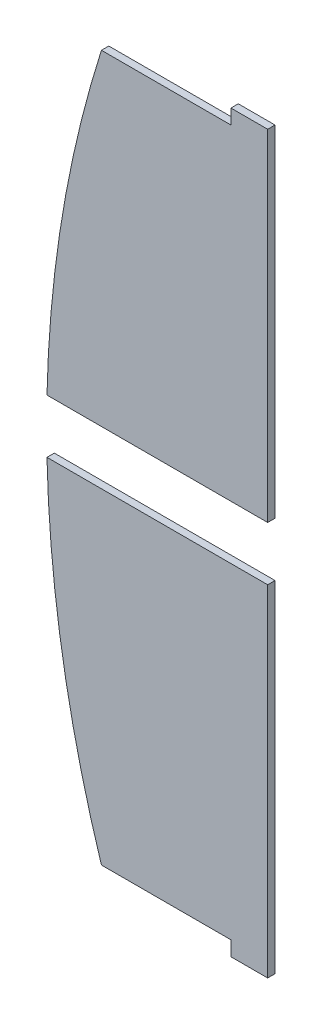
ISO-10303-21;
HEADER;
FILE_DESCRIPTION(('STEP AP214'),'2;1');
FILE_NAME('part.step','',(''),(''),'','','');
FILE_SCHEMA(('AUTOMOTIVE_DESIGN { 1 0 10303 214 1 1 1 1 }'));
ENDSEC;
DATA;
#1=APPLICATION_CONTEXT('core data for automotive mechanical design processes');
#2=APPLICATION_PROTOCOL_DEFINITION('international standard','automotive_design',2000,#1);
#3=PRODUCT_CONTEXT('',#1,'mechanical');
#4=PRODUCT('Part','Part','',(#3));
#5=PRODUCT_RELATED_PRODUCT_CATEGORY('part','',(#4));
#6=PRODUCT_DEFINITION_FORMATION('','',#4);
#7=PRODUCT_DEFINITION_CONTEXT('part definition',#1,'design');
#8=PRODUCT_DEFINITION('design','',#6,#7);
#9=PRODUCT_DEFINITION_SHAPE('','',#8);
#10=(LENGTH_UNIT() NAMED_UNIT(*) SI_UNIT(.MILLI.,.METRE.));
#11=(NAMED_UNIT(*) PLANE_ANGLE_UNIT() SI_UNIT($,.RADIAN.));
#12=(NAMED_UNIT(*) SI_UNIT($,.STERADIAN.) SOLID_ANGLE_UNIT());
#13=UNCERTAINTY_MEASURE_WITH_UNIT(LENGTH_MEASURE(1.E-05),#10,'distance_accuracy_value','');
#14=(GEOMETRIC_REPRESENTATION_CONTEXT(3) GLOBAL_UNCERTAINTY_ASSIGNED_CONTEXT((#13)) GLOBAL_UNIT_ASSIGNED_CONTEXT((#10,
#11,#12)) REPRESENTATION_CONTEXT('',''));
#15=CARTESIAN_POINT('',(0.,0.,0.));
#16=DIRECTION('',(0.,0.,1.));
#17=DIRECTION('',(1.,0.,0.));
#18=AXIS2_PLACEMENT_3D('',#15,#16,#17);
#19=CARTESIAN_POINT('',(0.,0.,-6.));
#20=DIRECTION('',(0.,0.,1.));
#21=DIRECTION('',(1.,0.,0.));
#22=AXIS2_PLACEMENT_3D('',#19,#20,#21);
#23=CYLINDRICAL_SURFACE('',#22,950.);
#24=DIRECTION('',(0.,0.,1.));
#25=VECTOR('',#24,1.);
#26=CARTESIAN_POINT('',(-905.293322630848,288.,-6.));
#27=LINE('',#26,#25);
#28=CARTESIAN_POINT('',(-905.293322630848,288.,-6.));
#29=VERTEX_POINT('',#28);
#30=CARTESIAN_POINT('',(-905.293322630848,288.,0.));
#31=VERTEX_POINT('',#30);
#32=EDGE_CURVE('E114',#29,#31,#27,.T.);
#33=ORIENTED_EDGE('',*,*,#32,.F.);
#34=CARTESIAN_POINT('',(0.,0.,-6.));
#35=DIRECTION('',(0.,0.,1.));
#36=DIRECTION('',(1.,0.,0.));
#37=AXIS2_PLACEMENT_3D('',#34,#35,#36);
#38=CIRCLE('',#37,950.);
#39=CARTESIAN_POINT('',(-949.74522899565,21.9999999999999,-6.));
#40=VERTEX_POINT('',#39);
#41=EDGE_CURVE('E126',#29,#40,#38,.T.);
#42=ORIENTED_EDGE('',*,*,#41,.T.);
#43=DIRECTION('',(0.,0.,1.));
#44=VECTOR('',#43,1.);
#45=CARTESIAN_POINT('',(-949.74522899565,21.9999999999999,-6.));
#46=LINE('',#45,#44);
#47=CARTESIAN_POINT('',(-949.74522899565,21.9999999999999,0.));
#48=VERTEX_POINT('',#47);
#49=EDGE_CURVE('E129',#48,#40,#46,.F.);
#50=ORIENTED_EDGE('',*,*,#49,.F.);
#51=CARTESIAN_POINT('',(0.,0.,0.));
#52=DIRECTION('',(0.,0.,1.));
#53=DIRECTION('',(1.,0.,0.));
#54=AXIS2_PLACEMENT_3D('',#51,#52,#53);
#55=CIRCLE('',#54,950.);
#56=EDGE_CURVE('E74',#31,#48,#55,.T.);
#57=ORIENTED_EDGE('',*,*,#56,.F.);
#58=EDGE_LOOP('',(#33,#42,#50,#57));
#59=FACE_BOUND('',#58,.T.);
#60=ADVANCED_FACE('F52',(#59),#23,.T.);
#61=CARTESIAN_POINT('',(0.,0.,-6.));
#62=DIRECTION('',(0.,0.,1.));
#63=DIRECTION('',(1.,0.,0.));
#64=AXIS2_PLACEMENT_3D('',#61,#62,#63);
#65=PLANE('',#64);
#66=DIRECTION('',(1.,0.,0.));
#67=VECTOR('',#66,1.);
#68=CARTESIAN_POINT('',(0.,288.,-6.));
#69=LINE('',#68,#67);
#70=CARTESIAN_POINT('',(-799.601809837321,288.,-6.));
#71=VERTEX_POINT('',#70);
#72=EDGE_CURVE('E123',#29,#71,#69,.T.);
#73=ORIENTED_EDGE('',*,*,#72,.T.);
#74=DIRECTION('',(0.,1.,0.));
#75=VECTOR('',#74,1.);
#76=CARTESIAN_POINT('',(-799.601809837321,0.,-6.));
#77=LINE('',#76,#75);
#78=CARTESIAN_POINT('',(-799.601809837321,300.,-6.00000000000001));
#79=VERTEX_POINT('',#78);
#80=EDGE_CURVE('E107',#71,#79,#77,.T.);
#81=ORIENTED_EDGE('',*,*,#80,.T.);
#82=DIRECTION('',(1.,0.,0.));
#83=VECTOR('',#82,1.);
#84=CARTESIAN_POINT('',(1.11022302462516E-13,300.,-6.));
#85=LINE('',#84,#83);
#86=CARTESIAN_POINT('',(-769.601809837321,300.,-6.00000000000001));
#87=VERTEX_POINT('',#86);
#88=EDGE_CURVE('E132',#87,#79,#85,.F.);
#89=ORIENTED_EDGE('',*,*,#88,.F.);
#90=DIRECTION('',(0.,-1.,0.));
#91=VECTOR('',#90,1.);
#92=CARTESIAN_POINT('',(-769.601809837321,300.,-6.00000000000001));
#93=LINE('',#92,#91);
#94=CARTESIAN_POINT('',(-769.601809837321,22.,-6.00000000000001));
#95=VERTEX_POINT('',#94);
#96=EDGE_CURVE('E143',#87,#95,#93,.T.);
#97=ORIENTED_EDGE('',*,*,#96,.T.);
#98=DIRECTION('',(-1.,0.,0.));
#99=VECTOR('',#98,1.);
#100=CARTESIAN_POINT('',(0.,22.0000000000001,-6.));
#101=LINE('',#100,#99);
#102=EDGE_CURVE('E140',#95,#40,#101,.T.);
#103=ORIENTED_EDGE('',*,*,#102,.T.);
#104=ORIENTED_EDGE('',*,*,#41,.F.);
#105=EDGE_LOOP('',(#73,#81,#89,#97,#103,#104));
#106=FACE_BOUND('',#105,.T.);
#107=ADVANCED_FACE('F157',(#106),#65,.F.);
#108=CARTESIAN_POINT('',(0.,0.,0.));
#109=DIRECTION('',(0.,0.,1.));
#110=DIRECTION('',(1.,0.,0.));
#111=AXIS2_PLACEMENT_3D('',#108,#109,#110);
#112=PLANE('',#111);
#113=DIRECTION('',(0.,1.,0.));
#114=VECTOR('',#113,1.);
#115=CARTESIAN_POINT('',(-799.601809837321,300.,0.));
#116=LINE('',#115,#114);
#117=CARTESIAN_POINT('',(-799.601809837321,288.,0.));
#118=VERTEX_POINT('',#117);
#119=CARTESIAN_POINT('',(-799.601809837321,300.,0.));
#120=VERTEX_POINT('',#119);
#121=EDGE_CURVE('E65',#118,#120,#116,.T.);
#122=ORIENTED_EDGE('',*,*,#121,.F.);
#123=DIRECTION('',(1.,0.,0.));
#124=VECTOR('',#123,1.);
#125=CARTESIAN_POINT('',(-799.601809837321,288.,0.));
#126=LINE('',#125,#124);
#127=EDGE_CURVE('E110',#31,#118,#126,.T.);
#128=ORIENTED_EDGE('',*,*,#127,.F.);
#129=ORIENTED_EDGE('',*,*,#56,.T.);
#130=DIRECTION('',(-1.,0.,0.));
#131=VECTOR('',#130,1.);
#132=CARTESIAN_POINT('',(-560.458867551649,22.,0.));
#133=LINE('',#132,#131);
#134=CARTESIAN_POINT('',(-769.601809837321,22.,0.));
#135=VERTEX_POINT('',#134);
#136=EDGE_CURVE('E59',#135,#48,#133,.T.);
#137=ORIENTED_EDGE('',*,*,#136,.F.);
#138=DIRECTION('',(0.,1.,0.));
#139=VECTOR('',#138,1.);
#140=CARTESIAN_POINT('',(-769.601809837321,300.,0.));
#141=LINE('',#140,#139);
#142=CARTESIAN_POINT('',(-769.601809837321,300.,0.));
#143=VERTEX_POINT('',#142);
#144=EDGE_CURVE('E131',#135,#143,#141,.T.);
#145=ORIENTED_EDGE('',*,*,#144,.T.);
#146=DIRECTION('',(-1.,0.,0.));
#147=VECTOR('',#146,1.);
#148=CARTESIAN_POINT('',(-1527.14795921947,300.,0.));
#149=LINE('',#148,#147);
#150=EDGE_CURVE('E119',#143,#120,#149,.T.);
#151=ORIENTED_EDGE('',*,*,#150,.T.);
#152=EDGE_LOOP('',(#122,#128,#129,#137,#145,#151));
#153=FACE_BOUND('',#152,.T.);
#154=ADVANCED_FACE('F117',(#153),#112,.T.);
#155=CARTESIAN_POINT('',(-769.601809837321,300.,-610.115804443304));
#156=DIRECTION('',(1.,0.,0.));
#157=DIRECTION('',(0.,1.,0.));
#158=AXIS2_PLACEMENT_3D('',#155,#156,#157);
#159=PLANE('',#158);
#160=DIRECTION('',(0.,0.,1.));
#161=VECTOR('',#160,1.);
#162=CARTESIAN_POINT('',(-769.601809837321,22.,-610.115804443304));
#163=LINE('',#162,#161);
#164=EDGE_CURVE('E127',#95,#135,#163,.T.);
#165=ORIENTED_EDGE('',*,*,#164,.F.);
#166=ORIENTED_EDGE('',*,*,#96,.F.);
#167=DIRECTION('',(0.,0.,1.));
#168=VECTOR('',#167,1.);
#169=CARTESIAN_POINT('',(-769.601809837321,300.,-610.115804443304));
#170=LINE('',#169,#168);
#171=EDGE_CURVE('E135',#87,#143,#170,.T.);
#172=ORIENTED_EDGE('',*,*,#171,.T.);
#173=ORIENTED_EDGE('',*,*,#144,.F.);
#174=EDGE_LOOP('',(#165,#166,#172,#173));
#175=FACE_BOUND('',#174,.T.);
#176=ADVANCED_FACE('F155',(#175),#159,.T.);
#177=CARTESIAN_POINT('',(-1527.14795921947,300.,0.));
#178=DIRECTION('',(0.,1.,0.));
#179=DIRECTION('',(-1.,0.,0.));
#180=AXIS2_PLACEMENT_3D('',#177,#178,#179);
#181=PLANE('',#180);
#182=DIRECTION('',(0.,0.,-1.));
#183=VECTOR('',#182,1.);
#184=CARTESIAN_POINT('',(-799.601809837321,300.,0.));
#185=LINE('',#184,#183);
#186=EDGE_CURVE('E12',#120,#79,#185,.T.);
#187=ORIENTED_EDGE('',*,*,#186,.F.);
#188=ORIENTED_EDGE('',*,*,#150,.F.);
#189=ORIENTED_EDGE('',*,*,#171,.F.);
#190=ORIENTED_EDGE('',*,*,#88,.T.);
#191=EDGE_LOOP('',(#187,#188,#189,#190));
#192=FACE_BOUND('',#191,.T.);
#193=ADVANCED_FACE('F153',(#192),#181,.T.);
#194=CARTESIAN_POINT('',(-560.458867551649,22.,-10.));
#195=DIRECTION('',(0.,1.,0.));
#196=DIRECTION('',(-1.,0.,0.));
#197=AXIS2_PLACEMENT_3D('',#194,#195,#196);
#198=PLANE('',#197);
#199=ORIENTED_EDGE('',*,*,#49,.T.);
#200=ORIENTED_EDGE('',*,*,#102,.F.);
#201=ORIENTED_EDGE('',*,*,#164,.T.);
#202=ORIENTED_EDGE('',*,*,#136,.T.);
#203=EDGE_LOOP('',(#199,#200,#201,#202));
#204=FACE_BOUND('',#203,.T.);
#205=ADVANCED_FACE('F162',(#204),#198,.F.);
#206=CARTESIAN_POINT('',(-799.601809837321,300.,-10.));
#207=DIRECTION('',(1.,0.,0.));
#208=DIRECTION('',(0.,0.,-1.));
#209=AXIS2_PLACEMENT_3D('',#206,#207,#208);
#210=PLANE('',#209);
#211=DIRECTION('',(0.,0.,1.));
#212=VECTOR('',#211,1.);
#213=CARTESIAN_POINT('',(-799.601809837321,288.,-10.));
#214=LINE('',#213,#212);
#215=EDGE_CURVE('E103',#71,#118,#214,.T.);
#216=ORIENTED_EDGE('',*,*,#215,.T.);
#217=ORIENTED_EDGE('',*,*,#121,.T.);
#218=ORIENTED_EDGE('',*,*,#186,.T.);
#219=ORIENTED_EDGE('',*,*,#80,.F.);
#220=EDGE_LOOP('',(#216,#217,#218,#219));
#221=FACE_BOUND('',#220,.T.);
#222=ADVANCED_FACE('F105',(#221),#210,.F.);
#223=CARTESIAN_POINT('',(-799.601809837321,288.,-10.));
#224=DIRECTION('',(0.,-1.,0.));
#225=DIRECTION('',(1.,0.,0.));
#226=AXIS2_PLACEMENT_3D('',#223,#224,#225);
#227=PLANE('',#226);
#228=ORIENTED_EDGE('',*,*,#32,.T.);
#229=ORIENTED_EDGE('',*,*,#127,.T.);
#230=ORIENTED_EDGE('',*,*,#215,.F.);
#231=ORIENTED_EDGE('',*,*,#72,.F.);
#232=EDGE_LOOP('',(#228,#229,#230,#231));
#233=FACE_BOUND('',#232,.T.);
#234=ADVANCED_FACE('F112',(#233),#227,.F.);
#235=CLOSED_SHELL('',(#60,#107,#154,#176,#193,#205,#222,#234));
#236=MANIFOLD_SOLID_BREP('B2',#235);
#237=CARTESIAN_POINT('',(-1527.14795921947,-300.,0.));
#238=DIRECTION('',(0.,-1.,0.));
#239=DIRECTION('',(1.,0.,0.));
#240=AXIS2_PLACEMENT_3D('',#237,#238,#239);
#241=PLANE('',#240);
#242=DIRECTION('',(0.,0.,1.));
#243=VECTOR('',#242,1.);
#244=CARTESIAN_POINT('',(-799.601809837321,-300.,-10.));
#245=LINE('',#244,#243);
#246=CARTESIAN_POINT('',(-799.601809837321,-300.,-6.));
#247=VERTEX_POINT('',#246);
#248=CARTESIAN_POINT('',(-799.601809837321,-300.,0.));
#249=VERTEX_POINT('',#248);
#250=EDGE_CURVE('E287',#247,#249,#245,.T.);
#251=ORIENTED_EDGE('',*,*,#250,.F.);
#252=DIRECTION('',(1.,0.,0.));
#253=VECTOR('',#252,1.);
#254=CARTESIAN_POINT('',(1.11022302462516E-13,-300.,-6.));
#255=LINE('',#254,#253);
#256=CARTESIAN_POINT('',(-769.601809837321,-300.,-6.00000000000001));
#257=VERTEX_POINT('',#256);
#258=EDGE_CURVE('E320',#247,#257,#255,.T.);
#259=ORIENTED_EDGE('',*,*,#258,.T.);
#260=DIRECTION('',(0.,0.,1.));
#261=VECTOR('',#260,1.);
#262=CARTESIAN_POINT('',(-769.601809837321,-300.,-610.115804443304));
#263=LINE('',#262,#261);
#264=CARTESIAN_POINT('',(-769.601809837321,-300.,0.));
#265=VERTEX_POINT('',#264);
#266=EDGE_CURVE('E315',#257,#265,#263,.T.);
#267=ORIENTED_EDGE('',*,*,#266,.T.);
#268=DIRECTION('',(1.,0.,0.));
#269=VECTOR('',#268,1.);
#270=CARTESIAN_POINT('',(-1527.14795921947,-300.,0.));
#271=LINE('',#270,#269);
#272=EDGE_CURVE('E314',#249,#265,#271,.T.);
#273=ORIENTED_EDGE('',*,*,#272,.F.);
#274=EDGE_LOOP('',(#251,#259,#267,#273));
#275=FACE_BOUND('',#274,.T.);
#276=ADVANCED_FACE('F230',(#275),#241,.T.);
#277=CARTESIAN_POINT('',(-769.601809837321,300.,-610.115804443304));
#278=DIRECTION('',(1.,0.,0.));
#279=DIRECTION('',(0.,1.,0.));
#280=AXIS2_PLACEMENT_3D('',#277,#278,#279);
#281=PLANE('',#280);
#282=DIRECTION('',(0.,0.,-1.));
#283=VECTOR('',#282,1.);
#284=CARTESIAN_POINT('',(-769.601809837321,-21.9999999999999,-610.115804443304));
#285=LINE('',#284,#283);
#286=CARTESIAN_POINT('',(-769.601809837321,-22.,0.));
#287=VERTEX_POINT('',#286);
#288=CARTESIAN_POINT('',(-769.601809837321,-21.9999999999999,-6.00000000000001));
#289=VERTEX_POINT('',#288);
#290=EDGE_CURVE('E326',#287,#289,#285,.T.);
#291=ORIENTED_EDGE('',*,*,#290,.F.);
#292=DIRECTION('',(0.,1.,0.));
#293=VECTOR('',#292,1.);
#294=CARTESIAN_POINT('',(-769.601809837321,300.,0.));
#295=LINE('',#294,#293);
#296=EDGE_CURVE('E310',#265,#287,#295,.T.);
#297=ORIENTED_EDGE('',*,*,#296,.F.);
#298=ORIENTED_EDGE('',*,*,#266,.F.);
#299=DIRECTION('',(0.,-1.,0.));
#300=VECTOR('',#299,1.);
#301=CARTESIAN_POINT('',(-769.601809837321,300.,-6.00000000000001));
#302=LINE('',#301,#300);
#303=EDGE_CURVE('E311',#289,#257,#302,.T.);
#304=ORIENTED_EDGE('',*,*,#303,.F.);
#305=EDGE_LOOP('',(#291,#297,#298,#304));
#306=FACE_BOUND('',#305,.T.);
#307=ADVANCED_FACE('F338',(#306),#281,.T.);
#308=CARTESIAN_POINT('',(1.11022302462516E-13,0.,0.));
#309=DIRECTION('',(0.,0.,1.));
#310=DIRECTION('',(1.,0.,0.));
#311=AXIS2_PLACEMENT_3D('',#308,#309,#310);
#312=PLANE('',#311);
#313=DIRECTION('',(0.,1.,0.));
#314=VECTOR('',#313,1.);
#315=CARTESIAN_POINT('',(-799.601809837321,-300.,0.));
#316=LINE('',#315,#314);
#317=CARTESIAN_POINT('',(-799.601809837321,-288.,0.));
#318=VERTEX_POINT('',#317);
#319=EDGE_CURVE('E290',#249,#318,#316,.T.);
#320=ORIENTED_EDGE('',*,*,#319,.F.);
#321=ORIENTED_EDGE('',*,*,#272,.T.);
#322=ORIENTED_EDGE('',*,*,#296,.T.);
#323=DIRECTION('',(1.,0.,0.));
#324=VECTOR('',#323,1.);
#325=CARTESIAN_POINT('',(-560.458867551649,-21.9999999999999,0.));
#326=LINE('',#325,#324);
#327=CARTESIAN_POINT('',(-949.74522899565,-22.,0.));
#328=VERTEX_POINT('',#327);
#329=EDGE_CURVE('E253',#328,#287,#326,.T.);
#330=ORIENTED_EDGE('',*,*,#329,.F.);
#331=CARTESIAN_POINT('',(1.11022302462516E-13,0.,0.));
#332=DIRECTION('',(0.,0.,1.));
#333=DIRECTION('',(1.,0.,0.));
#334=AXIS2_PLACEMENT_3D('',#331,#332,#333);
#335=CIRCLE('',#334,950.);
#336=CARTESIAN_POINT('',(-905.293322630848,-288.,0.));
#337=VERTEX_POINT('',#336);
#338=EDGE_CURVE('E299',#328,#337,#335,.T.);
#339=ORIENTED_EDGE('',*,*,#338,.T.);
#340=DIRECTION('',(-1.,0.,0.));
#341=VECTOR('',#340,1.);
#342=CARTESIAN_POINT('',(-799.601809837321,-288.,0.));
#343=LINE('',#342,#341);
#344=EDGE_CURVE('E245',#318,#337,#343,.T.);
#345=ORIENTED_EDGE('',*,*,#344,.F.);
#346=EDGE_LOOP('',(#320,#321,#322,#330,#339,#345));
#347=FACE_BOUND('',#346,.T.);
#348=ADVANCED_FACE('F297',(#347),#312,.T.);
#349=CARTESIAN_POINT('',(1.11022302462516E-13,0.,-6.));
#350=DIRECTION('',(0.,0.,1.));
#351=DIRECTION('',(1.,0.,0.));
#352=AXIS2_PLACEMENT_3D('',#349,#350,#351);
#353=PLANE('',#352);
#354=ORIENTED_EDGE('',*,*,#258,.F.);
#355=DIRECTION('',(0.,1.,0.));
#356=VECTOR('',#355,1.);
#357=CARTESIAN_POINT('',(-799.601809837321,0.,-6.));
#358=LINE('',#357,#356);
#359=CARTESIAN_POINT('',(-799.601809837321,-288.,-6.));
#360=VERTEX_POINT('',#359);
#361=EDGE_CURVE('E50',#247,#360,#358,.T.);
#362=ORIENTED_EDGE('',*,*,#361,.T.);
#363=DIRECTION('',(-1.,0.,0.));
#364=VECTOR('',#363,1.);
#365=CARTESIAN_POINT('',(0.,-288.,-6.));
#366=LINE('',#365,#364);
#367=CARTESIAN_POINT('',(-905.293322630848,-288.,-6.));
#368=VERTEX_POINT('',#367);
#369=EDGE_CURVE('E285',#360,#368,#366,.T.);
#370=ORIENTED_EDGE('',*,*,#369,.T.);
#371=CARTESIAN_POINT('',(1.11022302462516E-13,0.,-6.));
#372=DIRECTION('',(0.,0.,1.));
#373=DIRECTION('',(1.,0.,0.));
#374=AXIS2_PLACEMENT_3D('',#371,#372,#373);
#375=CIRCLE('',#374,950.);
#376=CARTESIAN_POINT('',(-949.74522899565,-22.,-6.));
#377=VERTEX_POINT('',#376);
#378=EDGE_CURVE('E323',#377,#368,#375,.T.);
#379=ORIENTED_EDGE('',*,*,#378,.F.);
#380=DIRECTION('',(1.,0.,0.));
#381=VECTOR('',#380,1.);
#382=CARTESIAN_POINT('',(1.11022302462516E-13,-21.9999999999999,-6.));
#383=LINE('',#382,#381);
#384=EDGE_CURVE('E305',#377,#289,#383,.T.);
#385=ORIENTED_EDGE('',*,*,#384,.T.);
#386=ORIENTED_EDGE('',*,*,#303,.T.);
#387=EDGE_LOOP('',(#354,#362,#370,#379,#385,#386));
#388=FACE_BOUND('',#387,.T.);
#389=ADVANCED_FACE('F332',(#388),#353,.F.);
#390=CARTESIAN_POINT('',(1.11022302462516E-13,0.,-6.));
#391=DIRECTION('',(0.,0.,1.));
#392=DIRECTION('',(1.,0.,0.));
#393=AXIS2_PLACEMENT_3D('',#390,#391,#392);
#394=CYLINDRICAL_SURFACE('',#393,950.);
#395=DIRECTION('',(0.,0.,1.));
#396=VECTOR('',#395,1.);
#397=CARTESIAN_POINT('',(-905.293322630848,-288.,-6.));
#398=LINE('',#397,#396);
#399=EDGE_CURVE('E238',#337,#368,#398,.F.);
#400=ORIENTED_EDGE('',*,*,#399,.F.);
#401=ORIENTED_EDGE('',*,*,#338,.F.);
#402=DIRECTION('',(0.,0.,1.));
#403=VECTOR('',#402,1.);
#404=CARTESIAN_POINT('',(-949.74522899565,-22.,-6.));
#405=LINE('',#404,#403);
#406=EDGE_CURVE('E308',#377,#328,#405,.T.);
#407=ORIENTED_EDGE('',*,*,#406,.F.);
#408=ORIENTED_EDGE('',*,*,#378,.T.);
#409=EDGE_LOOP('',(#400,#401,#407,#408));
#410=FACE_BOUND('',#409,.T.);
#411=ADVANCED_FACE('F232',(#410),#394,.T.);
#412=CARTESIAN_POINT('',(-560.458867551649,-21.9999999999999,-10.));
#413=DIRECTION('',(0.,-1.,0.));
#414=DIRECTION('',(1.,0.,0.));
#415=AXIS2_PLACEMENT_3D('',#412,#413,#414);
#416=PLANE('',#415);
#417=ORIENTED_EDGE('',*,*,#406,.T.);
#418=ORIENTED_EDGE('',*,*,#329,.T.);
#419=ORIENTED_EDGE('',*,*,#290,.T.);
#420=ORIENTED_EDGE('',*,*,#384,.F.);
#421=EDGE_LOOP('',(#417,#418,#419,#420));
#422=FACE_BOUND('',#421,.T.);
#423=ADVANCED_FACE('F334',(#422),#416,.F.);
#424=CARTESIAN_POINT('',(-799.601809837321,-300.,-10.));
#425=DIRECTION('',(1.,0.,0.));
#426=DIRECTION('',(0.,0.,-1.));
#427=AXIS2_PLACEMENT_3D('',#424,#425,#426);
#428=PLANE('',#427);
#429=ORIENTED_EDGE('',*,*,#250,.T.);
#430=ORIENTED_EDGE('',*,*,#319,.T.);
#431=DIRECTION('',(0.,0.,1.));
#432=VECTOR('',#431,1.);
#433=CARTESIAN_POINT('',(-799.601809837321,-288.,-10.));
#434=LINE('',#433,#432);
#435=EDGE_CURVE('E281',#360,#318,#434,.T.);
#436=ORIENTED_EDGE('',*,*,#435,.F.);
#437=ORIENTED_EDGE('',*,*,#361,.F.);
#438=EDGE_LOOP('',(#429,#430,#436,#437));
#439=FACE_BOUND('',#438,.T.);
#440=ADVANCED_FACE('F291',(#439),#428,.F.);
#441=CARTESIAN_POINT('',(-799.601809837321,-288.,-10.));
#442=DIRECTION('',(0.,1.,0.));
#443=DIRECTION('',(0.,0.,1.));
#444=AXIS2_PLACEMENT_3D('',#441,#442,#443);
#445=PLANE('',#444);
#446=ORIENTED_EDGE('',*,*,#435,.T.);
#447=ORIENTED_EDGE('',*,*,#344,.T.);
#448=ORIENTED_EDGE('',*,*,#399,.T.);
#449=ORIENTED_EDGE('',*,*,#369,.F.);
#450=EDGE_LOOP('',(#446,#447,#448,#449));
#451=FACE_BOUND('',#450,.T.);
#452=ADVANCED_FACE('F283',(#451),#445,.F.);
#453=CLOSED_SHELL('',(#276,#307,#348,#389,#411,#423,#440,#452));
#454=MANIFOLD_SOLID_BREP('B6',#453);
#455=ADVANCED_BREP_SHAPE_REPRESENTATION('',(#18,#236,#454),#14);
#456=SHAPE_DEFINITION_REPRESENTATION(#9,#455);
ENDSEC;
END-ISO-10303-21;
